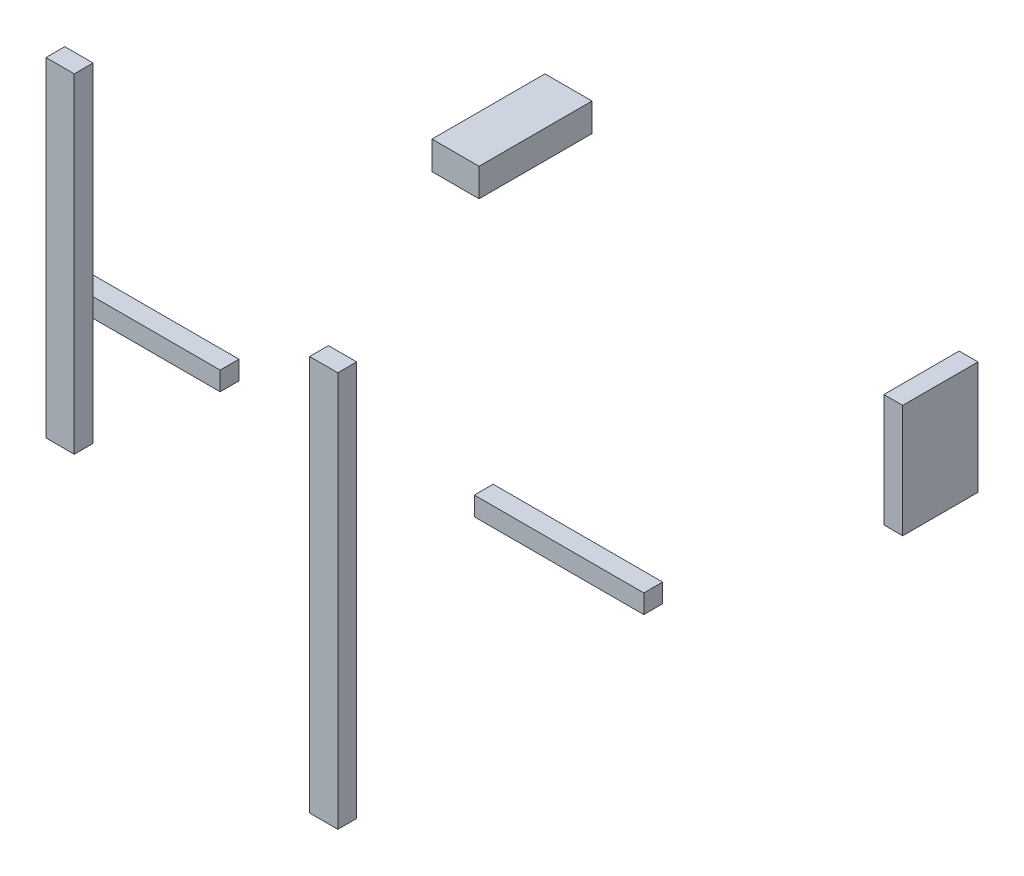
ISO-10303-21;
HEADER;
FILE_DESCRIPTION(('STEP AP214'),'2;1');
FILE_NAME('part.step','',(''),(''),'','','');
FILE_SCHEMA(('AUTOMOTIVE_DESIGN { 1 0 10303 214 1 1 1 1 }'));
ENDSEC;
DATA;
#1=APPLICATION_CONTEXT('core data for automotive mechanical design processes');
#2=APPLICATION_PROTOCOL_DEFINITION('international standard','automotive_design',2000,#1);
#3=PRODUCT_CONTEXT('',#1,'mechanical');
#4=PRODUCT('Part','Part','',(#3));
#5=PRODUCT_RELATED_PRODUCT_CATEGORY('part','',(#4));
#6=PRODUCT_DEFINITION_FORMATION('','',#4);
#7=PRODUCT_DEFINITION_CONTEXT('part definition',#1,'design');
#8=PRODUCT_DEFINITION('design','',#6,#7);
#9=PRODUCT_DEFINITION_SHAPE('','',#8);
#10=(LENGTH_UNIT() NAMED_UNIT(*) SI_UNIT(.MILLI.,.METRE.));
#11=(NAMED_UNIT(*) PLANE_ANGLE_UNIT() SI_UNIT($,.RADIAN.));
#12=(NAMED_UNIT(*) SI_UNIT($,.STERADIAN.) SOLID_ANGLE_UNIT());
#13=UNCERTAINTY_MEASURE_WITH_UNIT(LENGTH_MEASURE(1.E-05),#10,'distance_accuracy_value','');
#14=(GEOMETRIC_REPRESENTATION_CONTEXT(3) GLOBAL_UNCERTAINTY_ASSIGNED_CONTEXT((#13)) GLOBAL_UNIT_ASSIGNED_CONTEXT((#10,
#11,#12)) REPRESENTATION_CONTEXT('',''));
#15=CARTESIAN_POINT('',(0.,0.,0.));
#16=DIRECTION('',(0.,0.,1.));
#17=DIRECTION('',(1.,0.,0.));
#18=AXIS2_PLACEMENT_3D('',#15,#16,#17);
#19=CARTESIAN_POINT('',(51.5,0.,28.));
#20=DIRECTION('',(-1.,0.,0.));
#21=DIRECTION('',(0.,0.,1.));
#22=AXIS2_PLACEMENT_3D('',#19,#20,#21);
#23=PLANE('',#22);
#24=DIRECTION('',(0.,1.,0.));
#25=VECTOR('',#24,1.);
#26=CARTESIAN_POINT('',(51.5,0.,20.));
#27=LINE('',#26,#25);
#28=CARTESIAN_POINT('',(51.5,0.,20.));
#29=VERTEX_POINT('',#28);
#30=CARTESIAN_POINT('',(51.5,12.,20.));
#31=VERTEX_POINT('',#30);
#32=EDGE_CURVE('E109',#29,#31,#27,.T.);
#33=ORIENTED_EDGE('',*,*,#32,.T.);
#34=DIRECTION('',(0.,0.,-1.));
#35=VECTOR('',#34,1.);
#36=CARTESIAN_POINT('',(51.5,12.,28.));
#37=LINE('',#36,#35);
#38=CARTESIAN_POINT('',(51.5,12.,28.));
#39=VERTEX_POINT('',#38);
#40=EDGE_CURVE('E12',#39,#31,#37,.T.);
#41=ORIENTED_EDGE('',*,*,#40,.F.);
#42=DIRECTION('',(0.,1.,0.));
#43=VECTOR('',#42,1.);
#44=CARTESIAN_POINT('',(51.5,0.,28.));
#45=LINE('',#44,#43);
#46=CARTESIAN_POINT('',(51.5,0.,28.));
#47=VERTEX_POINT('',#46);
#48=EDGE_CURVE('E97',#47,#39,#45,.T.);
#49=ORIENTED_EDGE('',*,*,#48,.F.);
#50=DIRECTION('',(0.,0.,-1.));
#51=VECTOR('',#50,1.);
#52=CARTESIAN_POINT('',(51.5,0.,28.));
#53=LINE('',#52,#51);
#54=EDGE_CURVE('E105',#47,#29,#53,.T.);
#55=ORIENTED_EDGE('',*,*,#54,.T.);
#56=EDGE_LOOP('',(#33,#41,#49,#55));
#57=FACE_BOUND('',#56,.T.);
#58=ADVANCED_FACE('F46',(#57),#23,.F.);
#59=CARTESIAN_POINT('',(49.5,12.,28.));
#60=DIRECTION('',(0.,-1.,0.));
#61=DIRECTION('',(0.,0.,-1.));
#62=AXIS2_PLACEMENT_3D('',#59,#60,#61);
#63=PLANE('',#62);
#64=DIRECTION('',(-1.,0.,0.));
#65=VECTOR('',#64,1.);
#66=CARTESIAN_POINT('',(49.5,12.,20.));
#67=LINE('',#66,#65);
#68=CARTESIAN_POINT('',(49.5,12.,20.));
#69=VERTEX_POINT('',#68);
#70=EDGE_CURVE('E101',#31,#69,#67,.T.);
#71=ORIENTED_EDGE('',*,*,#70,.T.);
#72=DIRECTION('',(0.,0.,-1.));
#73=VECTOR('',#72,1.);
#74=CARTESIAN_POINT('',(49.5,12.,28.));
#75=LINE('',#74,#73);
#76=CARTESIAN_POINT('',(49.5,12.,28.));
#77=VERTEX_POINT('',#76);
#78=EDGE_CURVE('E54',#77,#69,#75,.T.);
#79=ORIENTED_EDGE('',*,*,#78,.F.);
#80=DIRECTION('',(-1.,0.,0.));
#81=VECTOR('',#80,1.);
#82=CARTESIAN_POINT('',(49.5,12.,28.));
#83=LINE('',#82,#81);
#84=EDGE_CURVE('E92',#39,#77,#83,.T.);
#85=ORIENTED_EDGE('',*,*,#84,.F.);
#86=ORIENTED_EDGE('',*,*,#40,.T.);
#87=EDGE_LOOP('',(#71,#79,#85,#86));
#88=FACE_BOUND('',#87,.T.);
#89=ADVANCED_FACE('F100',(#88),#63,.F.);
#90=CARTESIAN_POINT('',(49.5,0.,28.));
#91=DIRECTION('',(1.,0.,0.));
#92=DIRECTION('',(0.,0.,-1.));
#93=AXIS2_PLACEMENT_3D('',#90,#91,#92);
#94=PLANE('',#93);
#95=DIRECTION('',(0.,-1.,0.));
#96=VECTOR('',#95,1.);
#97=CARTESIAN_POINT('',(49.5,0.,20.));
#98=LINE('',#97,#96);
#99=CARTESIAN_POINT('',(49.5,0.,20.));
#100=VERTEX_POINT('',#99);
#101=EDGE_CURVE('E79',#69,#100,#98,.T.);
#102=ORIENTED_EDGE('',*,*,#101,.T.);
#103=DIRECTION('',(0.,0.,-1.));
#104=VECTOR('',#103,1.);
#105=CARTESIAN_POINT('',(49.5,0.,28.));
#106=LINE('',#105,#104);
#107=CARTESIAN_POINT('',(49.5,0.,28.));
#108=VERTEX_POINT('',#107);
#109=EDGE_CURVE('E102',#108,#100,#106,.T.);
#110=ORIENTED_EDGE('',*,*,#109,.F.);
#111=DIRECTION('',(0.,-1.,0.));
#112=VECTOR('',#111,1.);
#113=CARTESIAN_POINT('',(49.5,0.,28.));
#114=LINE('',#113,#112);
#115=EDGE_CURVE('E95',#77,#108,#114,.T.);
#116=ORIENTED_EDGE('',*,*,#115,.F.);
#117=ORIENTED_EDGE('',*,*,#78,.T.);
#118=EDGE_LOOP('',(#102,#110,#116,#117));
#119=FACE_BOUND('',#118,.T.);
#120=ADVANCED_FACE('F103',(#119),#94,.F.);
#121=CARTESIAN_POINT('',(49.5,0.,28.));
#122=DIRECTION('',(0.,1.,0.));
#123=DIRECTION('',(0.,0.,1.));
#124=AXIS2_PLACEMENT_3D('',#121,#122,#123);
#125=PLANE('',#124);
#126=DIRECTION('',(1.,0.,0.));
#127=VECTOR('',#126,1.);
#128=CARTESIAN_POINT('',(49.5,0.,20.));
#129=LINE('',#128,#127);
#130=EDGE_CURVE('E85',#100,#29,#129,.T.);
#131=ORIENTED_EDGE('',*,*,#130,.T.);
#132=ORIENTED_EDGE('',*,*,#54,.F.);
#133=DIRECTION('',(1.,0.,0.));
#134=VECTOR('',#133,1.);
#135=CARTESIAN_POINT('',(49.5,0.,28.));
#136=LINE('',#135,#134);
#137=EDGE_CURVE('E62',#108,#47,#136,.T.);
#138=ORIENTED_EDGE('',*,*,#137,.F.);
#139=ORIENTED_EDGE('',*,*,#109,.T.);
#140=EDGE_LOOP('',(#131,#132,#138,#139));
#141=FACE_BOUND('',#140,.T.);
#142=ADVANCED_FACE('F116',(#141),#125,.F.);
#143=CARTESIAN_POINT('',(0.,0.,28.));
#144=DIRECTION('',(0.,0.,-1.));
#145=DIRECTION('',(-1.,0.,0.));
#146=AXIS2_PLACEMENT_3D('',#143,#144,#145);
#147=PLANE('',#146);
#148=ORIENTED_EDGE('',*,*,#48,.T.);
#149=ORIENTED_EDGE('',*,*,#84,.T.);
#150=ORIENTED_EDGE('',*,*,#115,.T.);
#151=ORIENTED_EDGE('',*,*,#137,.T.);
#152=EDGE_LOOP('',(#148,#149,#150,#151));
#153=FACE_BOUND('',#152,.T.);
#154=ADVANCED_FACE('F93',(#153),#147,.F.);
#155=CARTESIAN_POINT('',(0.,0.,20.));
#156=DIRECTION('',(0.,0.,-1.));
#157=DIRECTION('',(-1.,0.,0.));
#158=AXIS2_PLACEMENT_3D('',#155,#156,#157);
#159=PLANE('',#158);
#160=ORIENTED_EDGE('',*,*,#32,.F.);
#161=ORIENTED_EDGE('',*,*,#130,.F.);
#162=ORIENTED_EDGE('',*,*,#101,.F.);
#163=ORIENTED_EDGE('',*,*,#70,.F.);
#164=EDGE_LOOP('',(#160,#161,#162,#163));
#165=FACE_BOUND('',#164,.T.);
#166=ADVANCED_FACE('F119',(#165),#159,.T.);
#167=CLOSED_SHELL('',(#58,#89,#120,#142,#154,#166));
#168=MANIFOLD_SOLID_BREP('B2',#167);
#169=CARTESIAN_POINT('',(2.5,4.5,24.));
#170=DIRECTION('',(-1.,0.,0.));
#171=DIRECTION('',(0.,0.,1.));
#172=AXIS2_PLACEMENT_3D('',#169,#170,#171);
#173=PLANE('',#172);
#174=DIRECTION('',(0.,1.,0.));
#175=VECTOR('',#174,1.);
#176=CARTESIAN_POINT('',(2.5,4.5,12.));
#177=LINE('',#176,#175);
#178=CARTESIAN_POINT('',(2.5,4.5,12.));
#179=VERTEX_POINT('',#178);
#180=CARTESIAN_POINT('',(2.5,7.5,12.));
#181=VERTEX_POINT('',#180);
#182=EDGE_CURVE('E243',#179,#181,#177,.T.);
#183=ORIENTED_EDGE('',*,*,#182,.T.);
#184=DIRECTION('',(0.,0.,-1.));
#185=VECTOR('',#184,1.);
#186=CARTESIAN_POINT('',(2.5,7.5,24.));
#187=LINE('',#186,#185);
#188=CARTESIAN_POINT('',(2.5,7.5,24.));
#189=VERTEX_POINT('',#188);
#190=EDGE_CURVE('E44',#189,#181,#187,.T.);
#191=ORIENTED_EDGE('',*,*,#190,.F.);
#192=DIRECTION('',(0.,1.,0.));
#193=VECTOR('',#192,1.);
#194=CARTESIAN_POINT('',(2.5,4.5,24.));
#195=LINE('',#194,#193);
#196=CARTESIAN_POINT('',(2.5,4.5,24.));
#197=VERTEX_POINT('',#196);
#198=EDGE_CURVE('E231',#197,#189,#195,.T.);
#199=ORIENTED_EDGE('',*,*,#198,.F.);
#200=DIRECTION('',(0.,0.,-1.));
#201=VECTOR('',#200,1.);
#202=CARTESIAN_POINT('',(2.5,4.5,24.));
#203=LINE('',#202,#201);
#204=EDGE_CURVE('E239',#197,#179,#203,.T.);
#205=ORIENTED_EDGE('',*,*,#204,.T.);
#206=EDGE_LOOP('',(#183,#191,#199,#205));
#207=FACE_BOUND('',#206,.T.);
#208=ADVANCED_FACE('F180',(#207),#173,.F.);
#209=CARTESIAN_POINT('',(-2.5,7.5,24.));
#210=DIRECTION('',(0.,-1.,0.));
#211=DIRECTION('',(0.,0.,-1.));
#212=AXIS2_PLACEMENT_3D('',#209,#210,#211);
#213=PLANE('',#212);
#214=DIRECTION('',(-1.,0.,0.));
#215=VECTOR('',#214,1.);
#216=CARTESIAN_POINT('',(-2.5,7.5,12.));
#217=LINE('',#216,#215);
#218=CARTESIAN_POINT('',(-2.5,7.5,12.));
#219=VERTEX_POINT('',#218);
#220=EDGE_CURVE('E235',#181,#219,#217,.T.);
#221=ORIENTED_EDGE('',*,*,#220,.T.);
#222=DIRECTION('',(0.,0.,-1.));
#223=VECTOR('',#222,1.);
#224=CARTESIAN_POINT('',(-2.5,7.5,24.));
#225=LINE('',#224,#223);
#226=CARTESIAN_POINT('',(-2.5,7.5,24.));
#227=VERTEX_POINT('',#226);
#228=EDGE_CURVE('E188',#227,#219,#225,.T.);
#229=ORIENTED_EDGE('',*,*,#228,.F.);
#230=DIRECTION('',(-1.,0.,0.));
#231=VECTOR('',#230,1.);
#232=CARTESIAN_POINT('',(-2.5,7.5,24.));
#233=LINE('',#232,#231);
#234=EDGE_CURVE('E226',#189,#227,#233,.T.);
#235=ORIENTED_EDGE('',*,*,#234,.F.);
#236=ORIENTED_EDGE('',*,*,#190,.T.);
#237=EDGE_LOOP('',(#221,#229,#235,#236));
#238=FACE_BOUND('',#237,.T.);
#239=ADVANCED_FACE('F234',(#238),#213,.F.);
#240=CARTESIAN_POINT('',(-2.5,4.5,24.));
#241=DIRECTION('',(1.,0.,0.));
#242=DIRECTION('',(0.,0.,-1.));
#243=AXIS2_PLACEMENT_3D('',#240,#241,#242);
#244=PLANE('',#243);
#245=DIRECTION('',(0.,-1.,0.));
#246=VECTOR('',#245,1.);
#247=CARTESIAN_POINT('',(-2.5,4.5,12.));
#248=LINE('',#247,#246);
#249=CARTESIAN_POINT('',(-2.5,4.5,12.));
#250=VERTEX_POINT('',#249);
#251=EDGE_CURVE('E213',#219,#250,#248,.T.);
#252=ORIENTED_EDGE('',*,*,#251,.T.);
#253=DIRECTION('',(0.,0.,-1.));
#254=VECTOR('',#253,1.);
#255=CARTESIAN_POINT('',(-2.5,4.5,24.));
#256=LINE('',#255,#254);
#257=CARTESIAN_POINT('',(-2.5,4.5,24.));
#258=VERTEX_POINT('',#257);
#259=EDGE_CURVE('E236',#258,#250,#256,.T.);
#260=ORIENTED_EDGE('',*,*,#259,.F.);
#261=DIRECTION('',(0.,-1.,0.));
#262=VECTOR('',#261,1.);
#263=CARTESIAN_POINT('',(-2.5,4.5,24.));
#264=LINE('',#263,#262);
#265=EDGE_CURVE('E229',#227,#258,#264,.T.);
#266=ORIENTED_EDGE('',*,*,#265,.F.);
#267=ORIENTED_EDGE('',*,*,#228,.T.);
#268=EDGE_LOOP('',(#252,#260,#266,#267));
#269=FACE_BOUND('',#268,.T.);
#270=ADVANCED_FACE('F237',(#269),#244,.F.);
#271=CARTESIAN_POINT('',(-2.5,4.5,24.));
#272=DIRECTION('',(0.,1.,0.));
#273=DIRECTION('',(0.,0.,1.));
#274=AXIS2_PLACEMENT_3D('',#271,#272,#273);
#275=PLANE('',#274);
#276=DIRECTION('',(1.,0.,0.));
#277=VECTOR('',#276,1.);
#278=CARTESIAN_POINT('',(-2.5,4.5,12.));
#279=LINE('',#278,#277);
#280=EDGE_CURVE('E219',#250,#179,#279,.T.);
#281=ORIENTED_EDGE('',*,*,#280,.T.);
#282=ORIENTED_EDGE('',*,*,#204,.F.);
#283=DIRECTION('',(1.,0.,0.));
#284=VECTOR('',#283,1.);
#285=CARTESIAN_POINT('',(-2.5,4.5,24.));
#286=LINE('',#285,#284);
#287=EDGE_CURVE('E196',#258,#197,#286,.T.);
#288=ORIENTED_EDGE('',*,*,#287,.F.);
#289=ORIENTED_EDGE('',*,*,#259,.T.);
#290=EDGE_LOOP('',(#281,#282,#288,#289));
#291=FACE_BOUND('',#290,.T.);
#292=ADVANCED_FACE('F250',(#291),#275,.F.);
#293=CARTESIAN_POINT('',(0.,0.,24.));
#294=DIRECTION('',(0.,0.,-1.));
#295=DIRECTION('',(-1.,0.,0.));
#296=AXIS2_PLACEMENT_3D('',#293,#294,#295);
#297=PLANE('',#296);
#298=ORIENTED_EDGE('',*,*,#198,.T.);
#299=ORIENTED_EDGE('',*,*,#234,.T.);
#300=ORIENTED_EDGE('',*,*,#265,.T.);
#301=ORIENTED_EDGE('',*,*,#287,.T.);
#302=EDGE_LOOP('',(#298,#299,#300,#301));
#303=FACE_BOUND('',#302,.T.);
#304=ADVANCED_FACE('F227',(#303),#297,.F.);
#305=CARTESIAN_POINT('',(0.,0.,12.));
#306=DIRECTION('',(0.,0.,-1.));
#307=DIRECTION('',(-1.,0.,0.));
#308=AXIS2_PLACEMENT_3D('',#305,#306,#307);
#309=PLANE('',#308);
#310=ORIENTED_EDGE('',*,*,#182,.F.);
#311=ORIENTED_EDGE('',*,*,#280,.F.);
#312=ORIENTED_EDGE('',*,*,#251,.F.);
#313=ORIENTED_EDGE('',*,*,#220,.F.);
#314=EDGE_LOOP('',(#310,#311,#312,#313));
#315=FACE_BOUND('',#314,.T.);
#316=ADVANCED_FACE('F253',(#315),#309,.T.);
#317=CLOSED_SHELL('',(#208,#239,#270,#292,#304,#316));
#318=MANIFOLD_SOLID_BREP('B6',#317);
#319=CARTESIAN_POINT('',(31.,-14.,35.));
#320=DIRECTION('',(-1.,0.,0.));
#321=DIRECTION('',(0.,0.,1.));
#322=AXIS2_PLACEMENT_3D('',#319,#320,#321);
#323=PLANE('',#322);
#324=DIRECTION('',(0.,1.,0.));
#325=VECTOR('',#324,1.);
#326=CARTESIAN_POINT('',(31.,-14.,33.));
#327=LINE('',#326,#325);
#328=CARTESIAN_POINT('',(31.,-14.,33.));
#329=VERTEX_POINT('',#328);
#330=CARTESIAN_POINT('',(31.,-12.,33.));
#331=VERTEX_POINT('',#330);
#332=EDGE_CURVE('E377',#329,#331,#327,.T.);
#333=ORIENTED_EDGE('',*,*,#332,.T.);
#334=DIRECTION('',(0.,0.,-1.));
#335=VECTOR('',#334,1.);
#336=CARTESIAN_POINT('',(31.,-12.,35.));
#337=LINE('',#336,#335);
#338=CARTESIAN_POINT('',(31.,-12.,35.));
#339=VERTEX_POINT('',#338);
#340=EDGE_CURVE('E178',#339,#331,#337,.T.);
#341=ORIENTED_EDGE('',*,*,#340,.F.);
#342=DIRECTION('',(0.,1.,0.));
#343=VECTOR('',#342,1.);
#344=CARTESIAN_POINT('',(31.,-14.,35.));
#345=LINE('',#344,#343);
#346=CARTESIAN_POINT('',(31.,-14.,35.));
#347=VERTEX_POINT('',#346);
#348=EDGE_CURVE('E365',#347,#339,#345,.T.);
#349=ORIENTED_EDGE('',*,*,#348,.F.);
#350=DIRECTION('',(0.,0.,-1.));
#351=VECTOR('',#350,1.);
#352=CARTESIAN_POINT('',(31.,-14.,35.));
#353=LINE('',#352,#351);
#354=EDGE_CURVE('E373',#347,#329,#353,.T.);
#355=ORIENTED_EDGE('',*,*,#354,.T.);
#356=EDGE_LOOP('',(#333,#341,#349,#355));
#357=FACE_BOUND('',#356,.T.);
#358=ADVANCED_FACE('F314',(#357),#323,.F.);
#359=CARTESIAN_POINT('',(13.,-12.,35.));
#360=DIRECTION('',(0.,-1.,0.));
#361=DIRECTION('',(0.,0.,-1.));
#362=AXIS2_PLACEMENT_3D('',#359,#360,#361);
#363=PLANE('',#362);
#364=DIRECTION('',(-1.,0.,0.));
#365=VECTOR('',#364,1.);
#366=CARTESIAN_POINT('',(13.,-12.,33.));
#367=LINE('',#366,#365);
#368=CARTESIAN_POINT('',(13.,-12.,33.));
#369=VERTEX_POINT('',#368);
#370=EDGE_CURVE('E369',#331,#369,#367,.T.);
#371=ORIENTED_EDGE('',*,*,#370,.T.);
#372=DIRECTION('',(0.,0.,-1.));
#373=VECTOR('',#372,1.);
#374=CARTESIAN_POINT('',(13.,-12.,35.));
#375=LINE('',#374,#373);
#376=CARTESIAN_POINT('',(13.,-12.,35.));
#377=VERTEX_POINT('',#376);
#378=EDGE_CURVE('E322',#377,#369,#375,.T.);
#379=ORIENTED_EDGE('',*,*,#378,.F.);
#380=DIRECTION('',(-1.,0.,0.));
#381=VECTOR('',#380,1.);
#382=CARTESIAN_POINT('',(13.,-12.,35.));
#383=LINE('',#382,#381);
#384=EDGE_CURVE('E360',#339,#377,#383,.T.);
#385=ORIENTED_EDGE('',*,*,#384,.F.);
#386=ORIENTED_EDGE('',*,*,#340,.T.);
#387=EDGE_LOOP('',(#371,#379,#385,#386));
#388=FACE_BOUND('',#387,.T.);
#389=ADVANCED_FACE('F368',(#388),#363,.F.);
#390=CARTESIAN_POINT('',(13.,-14.,35.));
#391=DIRECTION('',(1.,0.,0.));
#392=DIRECTION('',(0.,0.,-1.));
#393=AXIS2_PLACEMENT_3D('',#390,#391,#392);
#394=PLANE('',#393);
#395=DIRECTION('',(0.,-1.,0.));
#396=VECTOR('',#395,1.);
#397=CARTESIAN_POINT('',(13.,-14.,33.));
#398=LINE('',#397,#396);
#399=CARTESIAN_POINT('',(13.,-14.,33.));
#400=VERTEX_POINT('',#399);
#401=EDGE_CURVE('E347',#369,#400,#398,.T.);
#402=ORIENTED_EDGE('',*,*,#401,.T.);
#403=DIRECTION('',(0.,0.,-1.));
#404=VECTOR('',#403,1.);
#405=CARTESIAN_POINT('',(13.,-14.,35.));
#406=LINE('',#405,#404);
#407=CARTESIAN_POINT('',(13.,-14.,35.));
#408=VERTEX_POINT('',#407);
#409=EDGE_CURVE('E370',#408,#400,#406,.T.);
#410=ORIENTED_EDGE('',*,*,#409,.F.);
#411=DIRECTION('',(0.,-1.,0.));
#412=VECTOR('',#411,1.);
#413=CARTESIAN_POINT('',(13.,-14.,35.));
#414=LINE('',#413,#412);
#415=EDGE_CURVE('E363',#377,#408,#414,.T.);
#416=ORIENTED_EDGE('',*,*,#415,.F.);
#417=ORIENTED_EDGE('',*,*,#378,.T.);
#418=EDGE_LOOP('',(#402,#410,#416,#417));
#419=FACE_BOUND('',#418,.T.);
#420=ADVANCED_FACE('F371',(#419),#394,.F.);
#421=CARTESIAN_POINT('',(13.,-14.,35.));
#422=DIRECTION('',(0.,1.,0.));
#423=DIRECTION('',(0.,0.,1.));
#424=AXIS2_PLACEMENT_3D('',#421,#422,#423);
#425=PLANE('',#424);
#426=DIRECTION('',(1.,0.,0.));
#427=VECTOR('',#426,1.);
#428=CARTESIAN_POINT('',(13.,-14.,33.));
#429=LINE('',#428,#427);
#430=EDGE_CURVE('E353',#400,#329,#429,.T.);
#431=ORIENTED_EDGE('',*,*,#430,.T.);
#432=ORIENTED_EDGE('',*,*,#354,.F.);
#433=DIRECTION('',(1.,0.,0.));
#434=VECTOR('',#433,1.);
#435=CARTESIAN_POINT('',(13.,-14.,35.));
#436=LINE('',#435,#434);
#437=EDGE_CURVE('E330',#408,#347,#436,.T.);
#438=ORIENTED_EDGE('',*,*,#437,.F.);
#439=ORIENTED_EDGE('',*,*,#409,.T.);
#440=EDGE_LOOP('',(#431,#432,#438,#439));
#441=FACE_BOUND('',#440,.T.);
#442=ADVANCED_FACE('F384',(#441),#425,.F.);
#443=CARTESIAN_POINT('',(0.,0.,35.));
#444=DIRECTION('',(0.,0.,-1.));
#445=DIRECTION('',(-1.,0.,0.));
#446=AXIS2_PLACEMENT_3D('',#443,#444,#445);
#447=PLANE('',#446);
#448=ORIENTED_EDGE('',*,*,#348,.T.);
#449=ORIENTED_EDGE('',*,*,#384,.T.);
#450=ORIENTED_EDGE('',*,*,#415,.T.);
#451=ORIENTED_EDGE('',*,*,#437,.T.);
#452=EDGE_LOOP('',(#448,#449,#450,#451));
#453=FACE_BOUND('',#452,.T.);
#454=ADVANCED_FACE('F361',(#453),#447,.F.);
#455=CARTESIAN_POINT('',(0.,0.,33.));
#456=DIRECTION('',(0.,0.,-1.));
#457=DIRECTION('',(-1.,0.,0.));
#458=AXIS2_PLACEMENT_3D('',#455,#456,#457);
#459=PLANE('',#458);
#460=ORIENTED_EDGE('',*,*,#332,.F.);
#461=ORIENTED_EDGE('',*,*,#430,.F.);
#462=ORIENTED_EDGE('',*,*,#401,.F.);
#463=ORIENTED_EDGE('',*,*,#370,.F.);
#464=EDGE_LOOP('',(#460,#461,#462,#463));
#465=FACE_BOUND('',#464,.T.);
#466=ADVANCED_FACE('F387',(#465),#459,.T.);
#467=CLOSED_SHELL('',(#358,#389,#420,#442,#454,#466));
#468=MANIFOLD_SOLID_BREP('B38',#467);
#469=CARTESIAN_POINT('',(-12.,-14.,37.));
#470=DIRECTION('',(-1.,0.,0.));
#471=DIRECTION('',(0.,0.,1.));
#472=AXIS2_PLACEMENT_3D('',#469,#470,#471);
#473=PLANE('',#472);
#474=DIRECTION('',(0.,1.,0.));
#475=VECTOR('',#474,1.);
#476=CARTESIAN_POINT('',(-12.,-14.,35.));
#477=LINE('',#476,#475);
#478=CARTESIAN_POINT('',(-12.,-14.,35.));
#479=VERTEX_POINT('',#478);
#480=CARTESIAN_POINT('',(-12.,-12.,35.));
#481=VERTEX_POINT('',#480);
#482=EDGE_CURVE('E511',#479,#481,#477,.T.);
#483=ORIENTED_EDGE('',*,*,#482,.T.);
#484=DIRECTION('',(0.,0.,-1.));
#485=VECTOR('',#484,1.);
#486=CARTESIAN_POINT('',(-12.,-12.,37.));
#487=LINE('',#486,#485);
#488=CARTESIAN_POINT('',(-12.,-12.,37.));
#489=VERTEX_POINT('',#488);
#490=EDGE_CURVE('E312',#489,#481,#487,.T.);
#491=ORIENTED_EDGE('',*,*,#490,.F.);
#492=DIRECTION('',(0.,1.,0.));
#493=VECTOR('',#492,1.);
#494=CARTESIAN_POINT('',(-12.,-14.,37.));
#495=LINE('',#494,#493);
#496=CARTESIAN_POINT('',(-12.,-14.,37.));
#497=VERTEX_POINT('',#496);
#498=EDGE_CURVE('E499',#497,#489,#495,.T.);
#499=ORIENTED_EDGE('',*,*,#498,.F.);
#500=DIRECTION('',(0.,0.,-1.));
#501=VECTOR('',#500,1.);
#502=CARTESIAN_POINT('',(-12.,-14.,37.));
#503=LINE('',#502,#501);
#504=EDGE_CURVE('E507',#497,#479,#503,.T.);
#505=ORIENTED_EDGE('',*,*,#504,.T.);
#506=EDGE_LOOP('',(#483,#491,#499,#505));
#507=FACE_BOUND('',#506,.T.);
#508=ADVANCED_FACE('F448',(#507),#473,.F.);
#509=CARTESIAN_POINT('',(-30.,-12.,37.));
#510=DIRECTION('',(0.,-1.,0.));
#511=DIRECTION('',(0.,0.,-1.));
#512=AXIS2_PLACEMENT_3D('',#509,#510,#511);
#513=PLANE('',#512);
#514=DIRECTION('',(-1.,0.,0.));
#515=VECTOR('',#514,1.);
#516=CARTESIAN_POINT('',(-30.,-12.,35.));
#517=LINE('',#516,#515);
#518=CARTESIAN_POINT('',(-30.,-12.,35.));
#519=VERTEX_POINT('',#518);
#520=EDGE_CURVE('E503',#481,#519,#517,.T.);
#521=ORIENTED_EDGE('',*,*,#520,.T.);
#522=DIRECTION('',(0.,0.,-1.));
#523=VECTOR('',#522,1.);
#524=CARTESIAN_POINT('',(-30.,-12.,37.));
#525=LINE('',#524,#523);
#526=CARTESIAN_POINT('',(-30.,-12.,37.));
#527=VERTEX_POINT('',#526);
#528=EDGE_CURVE('E456',#527,#519,#525,.T.);
#529=ORIENTED_EDGE('',*,*,#528,.F.);
#530=DIRECTION('',(-1.,0.,0.));
#531=VECTOR('',#530,1.);
#532=CARTESIAN_POINT('',(-30.,-12.,37.));
#533=LINE('',#532,#531);
#534=EDGE_CURVE('E494',#489,#527,#533,.T.);
#535=ORIENTED_EDGE('',*,*,#534,.F.);
#536=ORIENTED_EDGE('',*,*,#490,.T.);
#537=EDGE_LOOP('',(#521,#529,#535,#536));
#538=FACE_BOUND('',#537,.T.);
#539=ADVANCED_FACE('F502',(#538),#513,.F.);
#540=CARTESIAN_POINT('',(-30.,-14.,37.));
#541=DIRECTION('',(1.,0.,0.));
#542=DIRECTION('',(0.,0.,-1.));
#543=AXIS2_PLACEMENT_3D('',#540,#541,#542);
#544=PLANE('',#543);
#545=DIRECTION('',(0.,-1.,0.));
#546=VECTOR('',#545,1.);
#547=CARTESIAN_POINT('',(-30.,-14.,35.));
#548=LINE('',#547,#546);
#549=CARTESIAN_POINT('',(-30.,-14.,35.));
#550=VERTEX_POINT('',#549);
#551=EDGE_CURVE('E481',#519,#550,#548,.T.);
#552=ORIENTED_EDGE('',*,*,#551,.T.);
#553=DIRECTION('',(0.,0.,-1.));
#554=VECTOR('',#553,1.);
#555=CARTESIAN_POINT('',(-30.,-14.,37.));
#556=LINE('',#555,#554);
#557=CARTESIAN_POINT('',(-30.,-14.,37.));
#558=VERTEX_POINT('',#557);
#559=EDGE_CURVE('E504',#558,#550,#556,.T.);
#560=ORIENTED_EDGE('',*,*,#559,.F.);
#561=DIRECTION('',(0.,-1.,0.));
#562=VECTOR('',#561,1.);
#563=CARTESIAN_POINT('',(-30.,-14.,37.));
#564=LINE('',#563,#562);
#565=EDGE_CURVE('E497',#527,#558,#564,.T.);
#566=ORIENTED_EDGE('',*,*,#565,.F.);
#567=ORIENTED_EDGE('',*,*,#528,.T.);
#568=EDGE_LOOP('',(#552,#560,#566,#567));
#569=FACE_BOUND('',#568,.T.);
#570=ADVANCED_FACE('F505',(#569),#544,.F.);
#571=CARTESIAN_POINT('',(-30.,-14.,37.));
#572=DIRECTION('',(0.,1.,0.));
#573=DIRECTION('',(0.,0.,1.));
#574=AXIS2_PLACEMENT_3D('',#571,#572,#573);
#575=PLANE('',#574);
#576=DIRECTION('',(1.,0.,0.));
#577=VECTOR('',#576,1.);
#578=CARTESIAN_POINT('',(-30.,-14.,35.));
#579=LINE('',#578,#577);
#580=EDGE_CURVE('E487',#550,#479,#579,.T.);
#581=ORIENTED_EDGE('',*,*,#580,.T.);
#582=ORIENTED_EDGE('',*,*,#504,.F.);
#583=DIRECTION('',(1.,0.,0.));
#584=VECTOR('',#583,1.);
#585=CARTESIAN_POINT('',(-30.,-14.,37.));
#586=LINE('',#585,#584);
#587=EDGE_CURVE('E464',#558,#497,#586,.T.);
#588=ORIENTED_EDGE('',*,*,#587,.F.);
#589=ORIENTED_EDGE('',*,*,#559,.T.);
#590=EDGE_LOOP('',(#581,#582,#588,#589));
#591=FACE_BOUND('',#590,.T.);
#592=ADVANCED_FACE('F518',(#591),#575,.F.);
#593=CARTESIAN_POINT('',(0.,0.,37.));
#594=DIRECTION('',(0.,0.,-1.));
#595=DIRECTION('',(-1.,0.,0.));
#596=AXIS2_PLACEMENT_3D('',#593,#594,#595);
#597=PLANE('',#596);
#598=ORIENTED_EDGE('',*,*,#498,.T.);
#599=ORIENTED_EDGE('',*,*,#534,.T.);
#600=ORIENTED_EDGE('',*,*,#565,.T.);
#601=ORIENTED_EDGE('',*,*,#587,.T.);
#602=EDGE_LOOP('',(#598,#599,#600,#601));
#603=FACE_BOUND('',#602,.T.);
#604=ADVANCED_FACE('F495',(#603),#597,.F.);
#605=CARTESIAN_POINT('',(0.,0.,35.));
#606=DIRECTION('',(0.,0.,-1.));
#607=DIRECTION('',(-1.,0.,0.));
#608=AXIS2_PLACEMENT_3D('',#605,#606,#607);
#609=PLANE('',#608);
#610=ORIENTED_EDGE('',*,*,#482,.F.);
#611=ORIENTED_EDGE('',*,*,#580,.F.);
#612=ORIENTED_EDGE('',*,*,#551,.F.);
#613=ORIENTED_EDGE('',*,*,#520,.F.);
#614=EDGE_LOOP('',(#610,#611,#612,#613));
#615=FACE_BOUND('',#614,.T.);
#616=ADVANCED_FACE('F521',(#615),#609,.T.);
#617=CLOSED_SHELL('',(#508,#539,#570,#592,#604,#616));
#618=MANIFOLD_SOLID_BREP('B172',#617);
#619=CARTESIAN_POINT('',(-16.5,-16.5,48.));
#620=DIRECTION('',(-1.,0.,0.));
#621=DIRECTION('',(0.,0.,1.));
#622=AXIS2_PLACEMENT_3D('',#619,#620,#621);
#623=PLANE('',#622);
#624=DIRECTION('',(0.,1.,0.));
#625=VECTOR('',#624,1.);
#626=CARTESIAN_POINT('',(-16.5,-16.5,46.));
#627=LINE('',#626,#625);
#628=CARTESIAN_POINT('',(-16.5,-16.5,46.));
#629=VERTEX_POINT('',#628);
#630=CARTESIAN_POINT('',(-16.5,18.5,46.));
#631=VERTEX_POINT('',#630);
#632=EDGE_CURVE('E644',#629,#631,#627,.T.);
#633=ORIENTED_EDGE('',*,*,#632,.T.);
#634=DIRECTION('',(0.,0.,-1.));
#635=VECTOR('',#634,1.);
#636=CARTESIAN_POINT('',(-16.5,18.5,48.));
#637=LINE('',#636,#635);
#638=CARTESIAN_POINT('',(-16.5,18.5,48.));
#639=VERTEX_POINT('',#638);
#640=EDGE_CURVE('E446',#639,#631,#637,.T.);
#641=ORIENTED_EDGE('',*,*,#640,.F.);
#642=DIRECTION('',(0.,1.,0.));
#643=VECTOR('',#642,1.);
#644=CARTESIAN_POINT('',(-16.5,-16.5,48.));
#645=LINE('',#644,#643);
#646=CARTESIAN_POINT('',(-16.5,-16.5,48.));
#647=VERTEX_POINT('',#646);
#648=EDGE_CURVE('E632',#647,#639,#645,.T.);
#649=ORIENTED_EDGE('',*,*,#648,.F.);
#650=DIRECTION('',(0.,0.,-1.));
#651=VECTOR('',#650,1.);
#652=CARTESIAN_POINT('',(-16.5,-16.5,48.));
#653=LINE('',#652,#651);
#654=EDGE_CURVE('E640',#647,#629,#653,.T.);
#655=ORIENTED_EDGE('',*,*,#654,.T.);
#656=EDGE_LOOP('',(#633,#641,#649,#655));
#657=FACE_BOUND('',#656,.T.);
#658=ADVANCED_FACE('F581',(#657),#623,.F.);
#659=CARTESIAN_POINT('',(-19.5,18.5,48.));
#660=DIRECTION('',(0.,-1.,0.));
#661=DIRECTION('',(0.,0.,-1.));
#662=AXIS2_PLACEMENT_3D('',#659,#660,#661);
#663=PLANE('',#662);
#664=DIRECTION('',(-1.,0.,0.));
#665=VECTOR('',#664,1.);
#666=CARTESIAN_POINT('',(-19.5,18.5,46.));
#667=LINE('',#666,#665);
#668=CARTESIAN_POINT('',(-19.5,18.5,46.));
#669=VERTEX_POINT('',#668);
#670=EDGE_CURVE('E636',#631,#669,#667,.T.);
#671=ORIENTED_EDGE('',*,*,#670,.T.);
#672=DIRECTION('',(0.,0.,-1.));
#673=VECTOR('',#672,1.);
#674=CARTESIAN_POINT('',(-19.5,18.5,48.));
#675=LINE('',#674,#673);
#676=CARTESIAN_POINT('',(-19.5,18.5,48.));
#677=VERTEX_POINT('',#676);
#678=EDGE_CURVE('E589',#677,#669,#675,.T.);
#679=ORIENTED_EDGE('',*,*,#678,.F.);
#680=DIRECTION('',(-1.,0.,0.));
#681=VECTOR('',#680,1.);
#682=CARTESIAN_POINT('',(-19.5,18.5,48.));
#683=LINE('',#682,#681);
#684=EDGE_CURVE('E627',#639,#677,#683,.T.);
#685=ORIENTED_EDGE('',*,*,#684,.F.);
#686=ORIENTED_EDGE('',*,*,#640,.T.);
#687=EDGE_LOOP('',(#671,#679,#685,#686));
#688=FACE_BOUND('',#687,.T.);
#689=ADVANCED_FACE('F635',(#688),#663,.F.);
#690=CARTESIAN_POINT('',(-19.5,-16.5,48.));
#691=DIRECTION('',(1.,0.,0.));
#692=DIRECTION('',(0.,0.,-1.));
#693=AXIS2_PLACEMENT_3D('',#690,#691,#692);
#694=PLANE('',#693);
#695=DIRECTION('',(0.,-1.,0.));
#696=VECTOR('',#695,1.);
#697=CARTESIAN_POINT('',(-19.5,-16.5,46.));
#698=LINE('',#697,#696);
#699=CARTESIAN_POINT('',(-19.5,-16.5,46.));
#700=VERTEX_POINT('',#699);
#701=EDGE_CURVE('E614',#669,#700,#698,.T.);
#702=ORIENTED_EDGE('',*,*,#701,.T.);
#703=DIRECTION('',(0.,0.,-1.));
#704=VECTOR('',#703,1.);
#705=CARTESIAN_POINT('',(-19.5,-16.5,48.));
#706=LINE('',#705,#704);
#707=CARTESIAN_POINT('',(-19.5,-16.5,48.));
#708=VERTEX_POINT('',#707);
#709=EDGE_CURVE('E637',#708,#700,#706,.T.);
#710=ORIENTED_EDGE('',*,*,#709,.F.);
#711=DIRECTION('',(0.,-1.,0.));
#712=VECTOR('',#711,1.);
#713=CARTESIAN_POINT('',(-19.5,-16.5,48.));
#714=LINE('',#713,#712);
#715=EDGE_CURVE('E630',#677,#708,#714,.T.);
#716=ORIENTED_EDGE('',*,*,#715,.F.);
#717=ORIENTED_EDGE('',*,*,#678,.T.);
#718=EDGE_LOOP('',(#702,#710,#716,#717));
#719=FACE_BOUND('',#718,.T.);
#720=ADVANCED_FACE('F638',(#719),#694,.F.);
#721=CARTESIAN_POINT('',(-19.5,-16.5,48.));
#722=DIRECTION('',(0.,1.,0.));
#723=DIRECTION('',(0.,0.,1.));
#724=AXIS2_PLACEMENT_3D('',#721,#722,#723);
#725=PLANE('',#724);
#726=DIRECTION('',(1.,0.,0.));
#727=VECTOR('',#726,1.);
#728=CARTESIAN_POINT('',(-19.5,-16.5,46.));
#729=LINE('',#728,#727);
#730=EDGE_CURVE('E620',#700,#629,#729,.T.);
#731=ORIENTED_EDGE('',*,*,#730,.T.);
#732=ORIENTED_EDGE('',*,*,#654,.F.);
#733=DIRECTION('',(1.,0.,0.));
#734=VECTOR('',#733,1.);
#735=CARTESIAN_POINT('',(-19.5,-16.5,48.));
#736=LINE('',#735,#734);
#737=EDGE_CURVE('E597',#708,#647,#736,.T.);
#738=ORIENTED_EDGE('',*,*,#737,.F.);
#739=ORIENTED_EDGE('',*,*,#709,.T.);
#740=EDGE_LOOP('',(#731,#732,#738,#739));
#741=FACE_BOUND('',#740,.T.);
#742=ADVANCED_FACE('F651',(#741),#725,.F.);
#743=CARTESIAN_POINT('',(0.,0.,48.));
#744=DIRECTION('',(0.,0.,-1.));
#745=DIRECTION('',(-1.,0.,0.));
#746=AXIS2_PLACEMENT_3D('',#743,#744,#745);
#747=PLANE('',#746);
#748=ORIENTED_EDGE('',*,*,#648,.T.);
#749=ORIENTED_EDGE('',*,*,#684,.T.);
#750=ORIENTED_EDGE('',*,*,#715,.T.);
#751=ORIENTED_EDGE('',*,*,#737,.T.);
#752=EDGE_LOOP('',(#748,#749,#750,#751));
#753=FACE_BOUND('',#752,.T.);
#754=ADVANCED_FACE('F628',(#753),#747,.F.);
#755=CARTESIAN_POINT('',(0.,0.,46.));
#756=DIRECTION('',(0.,0.,-1.));
#757=DIRECTION('',(-1.,0.,0.));
#758=AXIS2_PLACEMENT_3D('',#755,#756,#757);
#759=PLANE('',#758);
#760=ORIENTED_EDGE('',*,*,#632,.F.);
#761=ORIENTED_EDGE('',*,*,#730,.F.);
#762=ORIENTED_EDGE('',*,*,#701,.F.);
#763=ORIENTED_EDGE('',*,*,#670,.F.);
#764=EDGE_LOOP('',(#760,#761,#762,#763));
#765=FACE_BOUND('',#764,.T.);
#766=ADVANCED_FACE('F654',(#765),#759,.T.);
#767=CLOSED_SHELL('',(#658,#689,#720,#742,#754,#766));
#768=MANIFOLD_SOLID_BREP('B306',#767);
#769=CARTESIAN_POINT('',(1.5,-47.,38.));
#770=DIRECTION('',(-1.,0.,0.));
#771=DIRECTION('',(0.,0.,1.));
#772=AXIS2_PLACEMENT_3D('',#769,#770,#771);
#773=PLANE('',#772);
#774=DIRECTION('',(0.,1.,0.));
#775=VECTOR('',#774,1.);
#776=CARTESIAN_POINT('',(1.5,-47.,36.));
#777=LINE('',#776,#775);
#778=CARTESIAN_POINT('',(1.5,-47.,36.));
#779=VERTEX_POINT('',#778);
#780=CARTESIAN_POINT('',(1.5,-5.,36.));
#781=VERTEX_POINT('',#780);
#782=EDGE_CURVE('E768',#779,#781,#777,.T.);
#783=ORIENTED_EDGE('',*,*,#782,.T.);
#784=DIRECTION('',(0.,0.,-1.));
#785=VECTOR('',#784,1.);
#786=CARTESIAN_POINT('',(1.5,-5.,38.));
#787=LINE('',#786,#785);
#788=CARTESIAN_POINT('',(1.5,-5.,38.));
#789=VERTEX_POINT('',#788);
#790=EDGE_CURVE('E579',#789,#781,#787,.T.);
#791=ORIENTED_EDGE('',*,*,#790,.F.);
#792=DIRECTION('',(0.,1.,0.));
#793=VECTOR('',#792,1.);
#794=CARTESIAN_POINT('',(1.5,-47.,38.));
#795=LINE('',#794,#793);
#796=CARTESIAN_POINT('',(1.5,-47.,38.));
#797=VERTEX_POINT('',#796);
#798=EDGE_CURVE('E756',#797,#789,#795,.T.);
#799=ORIENTED_EDGE('',*,*,#798,.F.);
#800=DIRECTION('',(0.,0.,-1.));
#801=VECTOR('',#800,1.);
#802=CARTESIAN_POINT('',(1.5,-47.,38.));
#803=LINE('',#802,#801);
#804=EDGE_CURVE('E764',#797,#779,#803,.T.);
#805=ORIENTED_EDGE('',*,*,#804,.T.);
#806=EDGE_LOOP('',(#783,#791,#799,#805));
#807=FACE_BOUND('',#806,.T.);
#808=ADVANCED_FACE('F705',(#807),#773,.F.);
#809=CARTESIAN_POINT('',(-1.5,-5.,38.));
#810=DIRECTION('',(0.,-1.,0.));
#811=DIRECTION('',(0.,0.,-1.));
#812=AXIS2_PLACEMENT_3D('',#809,#810,#811);
#813=PLANE('',#812);
#814=DIRECTION('',(-1.,0.,0.));
#815=VECTOR('',#814,1.);
#816=CARTESIAN_POINT('',(-1.5,-5.,36.));
#817=LINE('',#816,#815);
#818=CARTESIAN_POINT('',(-1.5,-5.,36.));
#819=VERTEX_POINT('',#818);
#820=EDGE_CURVE('E760',#781,#819,#817,.T.);
#821=ORIENTED_EDGE('',*,*,#820,.T.);
#822=DIRECTION('',(0.,0.,-1.));
#823=VECTOR('',#822,1.);
#824=CARTESIAN_POINT('',(-1.5,-5.,38.));
#825=LINE('',#824,#823);
#826=CARTESIAN_POINT('',(-1.5,-5.,38.));
#827=VERTEX_POINT('',#826);
#828=EDGE_CURVE('E713',#827,#819,#825,.T.);
#829=ORIENTED_EDGE('',*,*,#828,.F.);
#830=DIRECTION('',(-1.,0.,0.));
#831=VECTOR('',#830,1.);
#832=CARTESIAN_POINT('',(-1.5,-5.,38.));
#833=LINE('',#832,#831);
#834=EDGE_CURVE('E751',#789,#827,#833,.T.);
#835=ORIENTED_EDGE('',*,*,#834,.F.);
#836=ORIENTED_EDGE('',*,*,#790,.T.);
#837=EDGE_LOOP('',(#821,#829,#835,#836));
#838=FACE_BOUND('',#837,.T.);
#839=ADVANCED_FACE('F759',(#838),#813,.F.);
#840=CARTESIAN_POINT('',(-1.5,-47.,38.));
#841=DIRECTION('',(1.,0.,0.));
#842=DIRECTION('',(0.,0.,-1.));
#843=AXIS2_PLACEMENT_3D('',#840,#841,#842);
#844=PLANE('',#843);
#845=DIRECTION('',(0.,-1.,0.));
#846=VECTOR('',#845,1.);
#847=CARTESIAN_POINT('',(-1.5,-47.,36.));
#848=LINE('',#847,#846);
#849=CARTESIAN_POINT('',(-1.5,-47.,36.));
#850=VERTEX_POINT('',#849);
#851=EDGE_CURVE('E738',#819,#850,#848,.T.);
#852=ORIENTED_EDGE('',*,*,#851,.T.);
#853=DIRECTION('',(0.,0.,-1.));
#854=VECTOR('',#853,1.);
#855=CARTESIAN_POINT('',(-1.5,-47.,38.));
#856=LINE('',#855,#854);
#857=CARTESIAN_POINT('',(-1.5,-47.,38.));
#858=VERTEX_POINT('',#857);
#859=EDGE_CURVE('E761',#858,#850,#856,.T.);
#860=ORIENTED_EDGE('',*,*,#859,.F.);
#861=DIRECTION('',(0.,-1.,0.));
#862=VECTOR('',#861,1.);
#863=CARTESIAN_POINT('',(-1.5,-47.,38.));
#864=LINE('',#863,#862);
#865=EDGE_CURVE('E754',#827,#858,#864,.T.);
#866=ORIENTED_EDGE('',*,*,#865,.F.);
#867=ORIENTED_EDGE('',*,*,#828,.T.);
#868=EDGE_LOOP('',(#852,#860,#866,#867));
#869=FACE_BOUND('',#868,.T.);
#870=ADVANCED_FACE('F762',(#869),#844,.F.);
#871=CARTESIAN_POINT('',(-1.5,-47.,38.));
#872=DIRECTION('',(0.,1.,0.));
#873=DIRECTION('',(0.,0.,1.));
#874=AXIS2_PLACEMENT_3D('',#871,#872,#873);
#875=PLANE('',#874);
#876=DIRECTION('',(1.,0.,0.));
#877=VECTOR('',#876,1.);
#878=CARTESIAN_POINT('',(-1.5,-47.,36.));
#879=LINE('',#878,#877);
#880=EDGE_CURVE('E744',#850,#779,#879,.T.);
#881=ORIENTED_EDGE('',*,*,#880,.T.);
#882=ORIENTED_EDGE('',*,*,#804,.F.);
#883=DIRECTION('',(1.,0.,0.));
#884=VECTOR('',#883,1.);
#885=CARTESIAN_POINT('',(-1.5,-47.,38.));
#886=LINE('',#885,#884);
#887=EDGE_CURVE('E721',#858,#797,#886,.T.);
#888=ORIENTED_EDGE('',*,*,#887,.F.);
#889=ORIENTED_EDGE('',*,*,#859,.T.);
#890=EDGE_LOOP('',(#881,#882,#888,#889));
#891=FACE_BOUND('',#890,.T.);
#892=ADVANCED_FACE('F775',(#891),#875,.F.);
#893=CARTESIAN_POINT('',(0.,0.,38.));
#894=DIRECTION('',(0.,0.,-1.));
#895=DIRECTION('',(-1.,0.,0.));
#896=AXIS2_PLACEMENT_3D('',#893,#894,#895);
#897=PLANE('',#896);
#898=ORIENTED_EDGE('',*,*,#798,.T.);
#899=ORIENTED_EDGE('',*,*,#834,.T.);
#900=ORIENTED_EDGE('',*,*,#865,.T.);
#901=ORIENTED_EDGE('',*,*,#887,.T.);
#902=EDGE_LOOP('',(#898,#899,#900,#901));
#903=FACE_BOUND('',#902,.T.);
#904=ADVANCED_FACE('F752',(#903),#897,.F.);
#905=CARTESIAN_POINT('',(0.,0.,36.));
#906=DIRECTION('',(0.,0.,-1.));
#907=DIRECTION('',(-1.,0.,0.));
#908=AXIS2_PLACEMENT_3D('',#905,#906,#907);
#909=PLANE('',#908);
#910=ORIENTED_EDGE('',*,*,#782,.F.);
#911=ORIENTED_EDGE('',*,*,#880,.F.);
#912=ORIENTED_EDGE('',*,*,#851,.F.);
#913=ORIENTED_EDGE('',*,*,#820,.F.);
#914=EDGE_LOOP('',(#910,#911,#912,#913));
#915=FACE_BOUND('',#914,.T.);
#916=ADVANCED_FACE('F778',(#915),#909,.T.);
#917=CLOSED_SHELL('',(#808,#839,#870,#892,#904,#916));
#918=MANIFOLD_SOLID_BREP('B440',#917);
#919=ADVANCED_BREP_SHAPE_REPRESENTATION('',(#18,#168,#318,#468,#618,#768,#918),#14);
#920=SHAPE_DEFINITION_REPRESENTATION(#9,#919);
ENDSEC;
END-ISO-10303-21;
